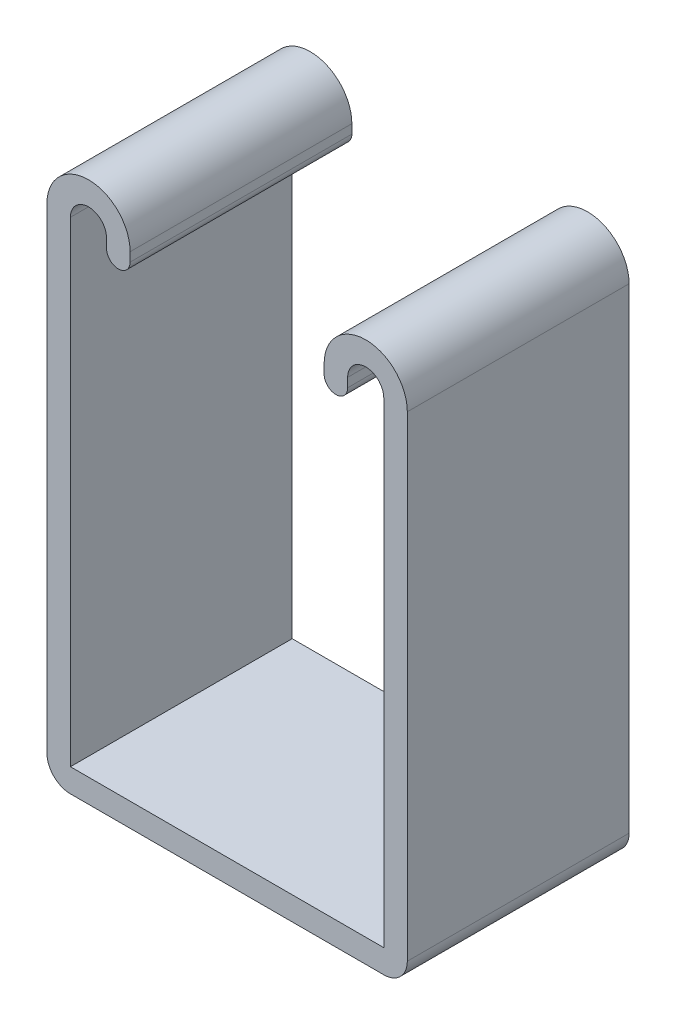
ISO-10303-21;
HEADER;
FILE_DESCRIPTION(('STEP AP214'),'2;1');
FILE_NAME('part.step','',(''),(''),'','','');
FILE_SCHEMA(('AUTOMOTIVE_DESIGN { 1 0 10303 214 1 1 1 1 }'));
ENDSEC;
DATA;
#1=APPLICATION_CONTEXT('core data for automotive mechanical design processes');
#2=APPLICATION_PROTOCOL_DEFINITION('international standard','automotive_design',2000,#1);
#3=PRODUCT_CONTEXT('',#1,'mechanical');
#4=PRODUCT('Part','Part','',(#3));
#5=PRODUCT_RELATED_PRODUCT_CATEGORY('part','',(#4));
#6=PRODUCT_DEFINITION_FORMATION('','',#4);
#7=PRODUCT_DEFINITION_CONTEXT('part definition',#1,'design');
#8=PRODUCT_DEFINITION('design','',#6,#7);
#9=PRODUCT_DEFINITION_SHAPE('','',#8);
#10=(LENGTH_UNIT() NAMED_UNIT(*) SI_UNIT(.MILLI.,.METRE.));
#11=(NAMED_UNIT(*) PLANE_ANGLE_UNIT() SI_UNIT($,.RADIAN.));
#12=(NAMED_UNIT(*) SI_UNIT($,.STERADIAN.) SOLID_ANGLE_UNIT());
#13=UNCERTAINTY_MEASURE_WITH_UNIT(LENGTH_MEASURE(1.E-05),#10,'distance_accuracy_value','');
#14=(GEOMETRIC_REPRESENTATION_CONTEXT(3) GLOBAL_UNCERTAINTY_ASSIGNED_CONTEXT((#13)) GLOBAL_UNIT_ASSIGNED_CONTEXT((#10,
#11,#12)) REPRESENTATION_CONTEXT('',''));
#15=CARTESIAN_POINT('',(0.,0.,0.));
#16=DIRECTION('',(0.,0.,1.));
#17=DIRECTION('',(1.,0.,0.));
#18=AXIS2_PLACEMENT_3D('',#15,#16,#17);
#19=CARTESIAN_POINT('',(-15.875,29.1719,12.7));
#20=DIRECTION('',(0.,0.,-1.));
#21=DIRECTION('',(-1.,0.,0.));
#22=AXIS2_PLACEMENT_3D('',#19,#20,#21);
#23=CYLINDRICAL_SURFACE('',#22,4.7625);
#24=CARTESIAN_POINT('',(-15.875,29.1719,-12.7));
#25=DIRECTION('',(0.,0.,1.));
#26=DIRECTION('',(-1.,0.,0.));
#27=AXIS2_PLACEMENT_3D('',#24,#25,#26);
#28=CIRCLE('',#27,4.7625);
#29=CARTESIAN_POINT('',(-11.1125,29.1719,-12.7));
#30=VERTEX_POINT('',#29);
#31=CARTESIAN_POINT('',(-20.6375,29.1719,-12.7));
#32=VERTEX_POINT('',#31);
#33=EDGE_CURVE('E188',#30,#32,#28,.T.);
#34=ORIENTED_EDGE('',*,*,#33,.T.);
#35=DIRECTION('',(0.,0.,-1.));
#36=VECTOR('',#35,1.);
#37=CARTESIAN_POINT('',(-20.6375,29.1719,12.7));
#38=LINE('',#37,#36);
#39=CARTESIAN_POINT('',(-20.6375,29.1719,12.7));
#40=VERTEX_POINT('',#39);
#41=EDGE_CURVE('E11',#40,#32,#38,.T.);
#42=ORIENTED_EDGE('',*,*,#41,.F.);
#43=CARTESIAN_POINT('',(-15.875,29.1719,12.7));
#44=DIRECTION('',(0.,0.,1.));
#45=DIRECTION('',(-1.,0.,0.));
#46=AXIS2_PLACEMENT_3D('',#43,#44,#45);
#47=CIRCLE('',#46,4.7625);
#48=CARTESIAN_POINT('',(-11.1125,29.1719,12.7));
#49=VERTEX_POINT('',#48);
#50=EDGE_CURVE('E222',#49,#40,#47,.T.);
#51=ORIENTED_EDGE('',*,*,#50,.F.);
#52=DIRECTION('',(0.,0.,-1.));
#53=VECTOR('',#52,1.);
#54=CARTESIAN_POINT('',(-11.1125,29.1719,12.7));
#55=LINE('',#54,#53);
#56=EDGE_CURVE('E184',#49,#30,#55,.T.);
#57=ORIENTED_EDGE('',*,*,#56,.T.);
#58=EDGE_LOOP('',(#34,#42,#51,#57));
#59=FACE_BOUND('',#58,.T.);
#60=ADVANCED_FACE('F32',(#59),#23,.T.);
#61=CARTESIAN_POINT('',(-20.6375,29.1719,12.7));
#62=DIRECTION('',(1.,0.,0.));
#63=DIRECTION('',(0.,1.,0.));
#64=AXIS2_PLACEMENT_3D('',#61,#62,#63);
#65=PLANE('',#64);
#66=DIRECTION('',(0.,-1.,0.));
#67=VECTOR('',#66,1.);
#68=CARTESIAN_POINT('',(-20.6375,29.1719,-12.7));
#69=LINE('',#68,#67);
#70=CARTESIAN_POINT('',(-20.6375,-25.3238,-12.7));
#71=VERTEX_POINT('',#70);
#72=EDGE_CURVE('E191',#32,#71,#69,.T.);
#73=ORIENTED_EDGE('',*,*,#72,.T.);
#74=DIRECTION('',(0.,0.,-1.));
#75=VECTOR('',#74,1.);
#76=CARTESIAN_POINT('',(-20.6375,-25.3238,12.7));
#77=LINE('',#76,#75);
#78=CARTESIAN_POINT('',(-20.6375,-25.3238,12.7));
#79=VERTEX_POINT('',#78);
#80=EDGE_CURVE('E40',#79,#71,#77,.T.);
#81=ORIENTED_EDGE('',*,*,#80,.F.);
#82=DIRECTION('',(0.,-1.,0.));
#83=VECTOR('',#82,1.);
#84=CARTESIAN_POINT('',(-20.6375,29.1719,12.7));
#85=LINE('',#84,#83);
#86=EDGE_CURVE('E121',#40,#79,#85,.T.);
#87=ORIENTED_EDGE('',*,*,#86,.F.);
#88=ORIENTED_EDGE('',*,*,#41,.T.);
#89=EDGE_LOOP('',(#73,#81,#87,#88));
#90=FACE_BOUND('',#89,.T.);
#91=ADVANCED_FACE('F330',(#90),#65,.F.);
#92=CARTESIAN_POINT('',(-17.9451,-25.3238,12.7));
#93=DIRECTION('',(0.,0.,-1.));
#94=DIRECTION('',(-1.,0.,0.));
#95=AXIS2_PLACEMENT_3D('',#92,#93,#94);
#96=CYLINDRICAL_SURFACE('',#95,2.6924);
#97=CARTESIAN_POINT('',(-17.9451,-25.3238,-12.7));
#98=DIRECTION('',(0.,0.,1.));
#99=DIRECTION('',(-1.,0.,0.));
#100=AXIS2_PLACEMENT_3D('',#97,#98,#99);
#101=CIRCLE('',#100,2.6924);
#102=CARTESIAN_POINT('',(-17.9451,-28.0162,-12.7));
#103=VERTEX_POINT('',#102);
#104=EDGE_CURVE('E193',#71,#103,#101,.T.);
#105=ORIENTED_EDGE('',*,*,#104,.T.);
#106=DIRECTION('',(0.,0.,-1.));
#107=VECTOR('',#106,1.);
#108=CARTESIAN_POINT('',(-17.9451,-28.0162,12.7));
#109=LINE('',#108,#107);
#110=CARTESIAN_POINT('',(-17.9451,-28.0162,12.7));
#111=VERTEX_POINT('',#110);
#112=EDGE_CURVE('E259',#111,#103,#109,.T.);
#113=ORIENTED_EDGE('',*,*,#112,.F.);
#114=CARTESIAN_POINT('',(-17.9451,-25.3238,12.7));
#115=DIRECTION('',(0.,0.,1.));
#116=DIRECTION('',(-1.,0.,0.));
#117=AXIS2_PLACEMENT_3D('',#114,#115,#116);
#118=CIRCLE('',#117,2.6924);
#119=EDGE_CURVE('E267',#79,#111,#118,.T.);
#120=ORIENTED_EDGE('',*,*,#119,.F.);
#121=ORIENTED_EDGE('',*,*,#80,.T.);
#122=EDGE_LOOP('',(#105,#113,#120,#121));
#123=FACE_BOUND('',#122,.T.);
#124=ADVANCED_FACE('F265',(#123),#96,.T.);
#125=CARTESIAN_POINT('',(-17.9451,-28.0162,12.7));
#126=DIRECTION('',(0.,1.,0.));
#127=DIRECTION('',(-1.,0.,0.));
#128=AXIS2_PLACEMENT_3D('',#125,#126,#127);
#129=PLANE('',#128);
#130=DIRECTION('',(1.,0.,0.));
#131=VECTOR('',#130,1.);
#132=CARTESIAN_POINT('',(-17.9451,-28.0162,-12.7));
#133=LINE('',#132,#131);
#134=CARTESIAN_POINT('',(17.9451,-28.0162,-12.7));
#135=VERTEX_POINT('',#134);
#136=EDGE_CURVE('E195',#103,#135,#133,.T.);
#137=ORIENTED_EDGE('',*,*,#136,.T.);
#138=DIRECTION('',(0.,0.,-1.));
#139=VECTOR('',#138,1.);
#140=CARTESIAN_POINT('',(17.9451,-28.0162,12.7));
#141=LINE('',#140,#139);
#142=CARTESIAN_POINT('',(17.9451,-28.0162,12.7));
#143=VERTEX_POINT('',#142);
#144=EDGE_CURVE('E256',#143,#135,#141,.T.);
#145=ORIENTED_EDGE('',*,*,#144,.F.);
#146=DIRECTION('',(1.,0.,0.));
#147=VECTOR('',#146,1.);
#148=CARTESIAN_POINT('',(-17.9451,-28.0162,12.7));
#149=LINE('',#148,#147);
#150=EDGE_CURVE('E285',#111,#143,#149,.T.);
#151=ORIENTED_EDGE('',*,*,#150,.F.);
#152=ORIENTED_EDGE('',*,*,#112,.T.);
#153=EDGE_LOOP('',(#137,#145,#151,#152));
#154=FACE_BOUND('',#153,.T.);
#155=ADVANCED_FACE('F276',(#154),#129,.F.);
#156=CARTESIAN_POINT('',(17.9451,-25.3238,12.7));
#157=DIRECTION('',(0.,0.,-1.));
#158=DIRECTION('',(-1.,0.,0.));
#159=AXIS2_PLACEMENT_3D('',#156,#157,#158);
#160=CYLINDRICAL_SURFACE('',#159,2.6924);
#161=CARTESIAN_POINT('',(17.9451,-25.3238,-12.7));
#162=DIRECTION('',(0.,0.,1.));
#163=DIRECTION('',(1.,0.,0.));
#164=AXIS2_PLACEMENT_3D('',#161,#162,#163);
#165=CIRCLE('',#164,2.6924);
#166=CARTESIAN_POINT('',(20.6375,-25.3238,-12.7));
#167=VERTEX_POINT('',#166);
#168=EDGE_CURVE('E197',#135,#167,#165,.T.);
#169=ORIENTED_EDGE('',*,*,#168,.T.);
#170=DIRECTION('',(0.,0.,-1.));
#171=VECTOR('',#170,1.);
#172=CARTESIAN_POINT('',(20.6375,-25.3238,12.7));
#173=LINE('',#172,#171);
#174=CARTESIAN_POINT('',(20.6375,-25.3238,12.7));
#175=VERTEX_POINT('',#174);
#176=EDGE_CURVE('E253',#175,#167,#173,.T.);
#177=ORIENTED_EDGE('',*,*,#176,.F.);
#178=CARTESIAN_POINT('',(17.9451,-25.3238,12.7));
#179=DIRECTION('',(0.,0.,1.));
#180=DIRECTION('',(1.,0.,0.));
#181=AXIS2_PLACEMENT_3D('',#178,#179,#180);
#182=CIRCLE('',#181,2.6924);
#183=EDGE_CURVE('E282',#143,#175,#182,.T.);
#184=ORIENTED_EDGE('',*,*,#183,.F.);
#185=ORIENTED_EDGE('',*,*,#144,.T.);
#186=EDGE_LOOP('',(#169,#177,#184,#185));
#187=FACE_BOUND('',#186,.T.);
#188=ADVANCED_FACE('F280',(#187),#160,.T.);
#189=CARTESIAN_POINT('',(20.6375,-25.3238,12.7));
#190=DIRECTION('',(-1.,0.,0.));
#191=DIRECTION('',(0.,-1.,0.));
#192=AXIS2_PLACEMENT_3D('',#189,#190,#191);
#193=PLANE('',#192);
#194=DIRECTION('',(0.,1.,0.));
#195=VECTOR('',#194,1.);
#196=CARTESIAN_POINT('',(20.6375,-25.3238,-12.7));
#197=LINE('',#196,#195);
#198=CARTESIAN_POINT('',(20.6375,29.1719,-12.7));
#199=VERTEX_POINT('',#198);
#200=EDGE_CURVE('E199',#167,#199,#197,.T.);
#201=ORIENTED_EDGE('',*,*,#200,.T.);
#202=DIRECTION('',(0.,0.,-1.));
#203=VECTOR('',#202,1.);
#204=CARTESIAN_POINT('',(20.6375,29.1719,12.7));
#205=LINE('',#204,#203);
#206=CARTESIAN_POINT('',(20.6375,29.1719,12.7));
#207=VERTEX_POINT('',#206);
#208=EDGE_CURVE('E250',#207,#199,#205,.T.);
#209=ORIENTED_EDGE('',*,*,#208,.F.);
#210=DIRECTION('',(0.,1.,0.));
#211=VECTOR('',#210,1.);
#212=CARTESIAN_POINT('',(20.6375,-25.3238,12.7));
#213=LINE('',#212,#211);
#214=EDGE_CURVE('E284',#175,#207,#213,.T.);
#215=ORIENTED_EDGE('',*,*,#214,.F.);
#216=ORIENTED_EDGE('',*,*,#176,.T.);
#217=EDGE_LOOP('',(#201,#209,#215,#216));
#218=FACE_BOUND('',#217,.T.);
#219=ADVANCED_FACE('F343',(#218),#193,.F.);
#220=CARTESIAN_POINT('',(15.875,29.1719,12.7));
#221=DIRECTION('',(0.,0.,-1.));
#222=DIRECTION('',(-1.,0.,0.));
#223=AXIS2_PLACEMENT_3D('',#220,#221,#222);
#224=CYLINDRICAL_SURFACE('',#223,4.7625);
#225=CARTESIAN_POINT('',(15.875,29.1719,-12.7));
#226=DIRECTION('',(0.,0.,1.));
#227=DIRECTION('',(1.,0.,0.));
#228=AXIS2_PLACEMENT_3D('',#225,#226,#227);
#229=CIRCLE('',#228,4.7625);
#230=CARTESIAN_POINT('',(11.1125,29.1719,-12.7));
#231=VERTEX_POINT('',#230);
#232=EDGE_CURVE('E201',#199,#231,#229,.T.);
#233=ORIENTED_EDGE('',*,*,#232,.T.);
#234=DIRECTION('',(0.,0.,-1.));
#235=VECTOR('',#234,1.);
#236=CARTESIAN_POINT('',(11.1125,29.1719,12.7));
#237=LINE('',#236,#235);
#238=CARTESIAN_POINT('',(11.1125,29.1719,12.7));
#239=VERTEX_POINT('',#238);
#240=EDGE_CURVE('E247',#239,#231,#237,.T.);
#241=ORIENTED_EDGE('',*,*,#240,.F.);
#242=CARTESIAN_POINT('',(15.875,29.1719,12.7));
#243=DIRECTION('',(0.,0.,1.));
#244=DIRECTION('',(1.,0.,0.));
#245=AXIS2_PLACEMENT_3D('',#242,#243,#244);
#246=CIRCLE('',#245,4.7625);
#247=EDGE_CURVE('E287',#207,#239,#246,.T.);
#248=ORIENTED_EDGE('',*,*,#247,.F.);
#249=ORIENTED_EDGE('',*,*,#208,.T.);
#250=EDGE_LOOP('',(#233,#241,#248,#249));
#251=FACE_BOUND('',#250,.T.);
#252=ADVANCED_FACE('F346',(#251),#224,.T.);
#253=CARTESIAN_POINT('',(11.1125,29.1719,12.7));
#254=DIRECTION('',(1.,0.,0.));
#255=DIRECTION('',(0.,1.,0.));
#256=AXIS2_PLACEMENT_3D('',#253,#254,#255);
#257=PLANE('',#256);
#258=DIRECTION('',(0.,-1.,0.));
#259=VECTOR('',#258,1.);
#260=CARTESIAN_POINT('',(11.1125,29.1719,-12.7));
#261=LINE('',#260,#259);
#262=CARTESIAN_POINT('',(11.1125,28.13685,-12.7));
#263=VERTEX_POINT('',#262);
#264=EDGE_CURVE('E203',#231,#263,#261,.T.);
#265=ORIENTED_EDGE('',*,*,#264,.T.);
#266=DIRECTION('',(0.,0.,-1.));
#267=VECTOR('',#266,1.);
#268=CARTESIAN_POINT('',(11.1125,28.13685,12.7));
#269=LINE('',#268,#267);
#270=CARTESIAN_POINT('',(11.1125,28.13685,12.7));
#271=VERTEX_POINT('',#270);
#272=EDGE_CURVE('E244',#271,#263,#269,.T.);
#273=ORIENTED_EDGE('',*,*,#272,.F.);
#274=DIRECTION('',(0.,-1.,0.));
#275=VECTOR('',#274,1.);
#276=CARTESIAN_POINT('',(11.1125,29.1719,12.7));
#277=LINE('',#276,#275);
#278=EDGE_CURVE('E293',#239,#271,#277,.T.);
#279=ORIENTED_EDGE('',*,*,#278,.F.);
#280=ORIENTED_EDGE('',*,*,#240,.T.);
#281=EDGE_LOOP('',(#265,#273,#279,#280));
#282=FACE_BOUND('',#281,.T.);
#283=ADVANCED_FACE('F350',(#282),#257,.F.);
#284=CARTESIAN_POINT('',(12.4587,28.13685,12.7));
#285=DIRECTION('',(0.,0.,-1.));
#286=DIRECTION('',(-1.,0.,0.));
#287=AXIS2_PLACEMENT_3D('',#284,#285,#286);
#288=CYLINDRICAL_SURFACE('',#287,1.3462);
#289=CARTESIAN_POINT('',(12.4587,28.13685,-12.7));
#290=DIRECTION('',(0.,0.,1.));
#291=DIRECTION('',(1.,0.,0.));
#292=AXIS2_PLACEMENT_3D('',#289,#290,#291);
#293=CIRCLE('',#292,1.3462);
#294=CARTESIAN_POINT('',(13.8049,28.13685,-12.7));
#295=VERTEX_POINT('',#294);
#296=EDGE_CURVE('E205',#263,#295,#293,.T.);
#297=ORIENTED_EDGE('',*,*,#296,.T.);
#298=DIRECTION('',(0.,0.,-1.));
#299=VECTOR('',#298,1.);
#300=CARTESIAN_POINT('',(13.8049,28.13685,12.7));
#301=LINE('',#300,#299);
#302=CARTESIAN_POINT('',(13.8049,28.13685,12.7));
#303=VERTEX_POINT('',#302);
#304=EDGE_CURVE('E241',#303,#295,#301,.T.);
#305=ORIENTED_EDGE('',*,*,#304,.F.);
#306=CARTESIAN_POINT('',(12.4587,28.13685,12.7));
#307=DIRECTION('',(0.,0.,1.));
#308=DIRECTION('',(1.,0.,0.));
#309=AXIS2_PLACEMENT_3D('',#306,#307,#308);
#310=CIRCLE('',#309,1.3462);
#311=EDGE_CURVE('E295',#271,#303,#310,.T.);
#312=ORIENTED_EDGE('',*,*,#311,.F.);
#313=ORIENTED_EDGE('',*,*,#272,.T.);
#314=EDGE_LOOP('',(#297,#305,#312,#313));
#315=FACE_BOUND('',#314,.T.);
#316=ADVANCED_FACE('F354',(#315),#288,.T.);
#317=CARTESIAN_POINT('',(13.8049,29.1719,12.7));
#318=DIRECTION('',(-1.,0.,0.));
#319=DIRECTION('',(0.,0.,1.));
#320=AXIS2_PLACEMENT_3D('',#317,#318,#319);
#321=PLANE('',#320);
#322=DIRECTION('',(0.,1.,0.));
#323=VECTOR('',#322,1.);
#324=CARTESIAN_POINT('',(13.8049,29.1719,-12.7));
#325=LINE('',#324,#323);
#326=CARTESIAN_POINT('',(13.8049,29.1719,-12.7));
#327=VERTEX_POINT('',#326);
#328=EDGE_CURVE('E207',#295,#327,#325,.T.);
#329=ORIENTED_EDGE('',*,*,#328,.T.);
#330=DIRECTION('',(0.,0.,-1.));
#331=VECTOR('',#330,1.);
#332=CARTESIAN_POINT('',(13.8049,29.1719,12.7));
#333=LINE('',#332,#331);
#334=CARTESIAN_POINT('',(13.8049,29.1719,12.7));
#335=VERTEX_POINT('',#334);
#336=EDGE_CURVE('E238',#335,#327,#333,.T.);
#337=ORIENTED_EDGE('',*,*,#336,.F.);
#338=DIRECTION('',(0.,1.,0.));
#339=VECTOR('',#338,1.);
#340=CARTESIAN_POINT('',(13.8049,29.1719,12.7));
#341=LINE('',#340,#339);
#342=EDGE_CURVE('E297',#303,#335,#341,.T.);
#343=ORIENTED_EDGE('',*,*,#342,.F.);
#344=ORIENTED_EDGE('',*,*,#304,.T.);
#345=EDGE_LOOP('',(#329,#337,#343,#344));
#346=FACE_BOUND('',#345,.T.);
#347=ADVANCED_FACE('F358',(#346),#321,.F.);
#348=CARTESIAN_POINT('',(15.875,29.1719,12.7));
#349=DIRECTION('',(0.,0.,-1.));
#350=DIRECTION('',(-1.,0.,0.));
#351=AXIS2_PLACEMENT_3D('',#348,#349,#350);
#352=CYLINDRICAL_SURFACE('',#351,2.0701);
#353=CARTESIAN_POINT('',(15.875,29.1719,-12.7));
#354=DIRECTION('',(0.,0.,-1.));
#355=DIRECTION('',(1.,0.,0.));
#356=AXIS2_PLACEMENT_3D('',#353,#354,#355);
#357=CIRCLE('',#356,2.0701);
#358=CARTESIAN_POINT('',(17.9451,29.1719,-12.7));
#359=VERTEX_POINT('',#358);
#360=EDGE_CURVE('E209',#327,#359,#357,.T.);
#361=ORIENTED_EDGE('',*,*,#360,.T.);
#362=DIRECTION('',(0.,0.,-1.));
#363=VECTOR('',#362,1.);
#364=CARTESIAN_POINT('',(17.9451,29.1719,12.7));
#365=LINE('',#364,#363);
#366=CARTESIAN_POINT('',(17.9451,29.1719,12.7));
#367=VERTEX_POINT('',#366);
#368=EDGE_CURVE('E235',#367,#359,#365,.T.);
#369=ORIENTED_EDGE('',*,*,#368,.F.);
#370=CARTESIAN_POINT('',(15.875,29.1719,12.7));
#371=DIRECTION('',(0.,0.,-1.));
#372=DIRECTION('',(1.,0.,0.));
#373=AXIS2_PLACEMENT_3D('',#370,#371,#372);
#374=CIRCLE('',#373,2.0701);
#375=EDGE_CURVE('E299',#335,#367,#374,.T.);
#376=ORIENTED_EDGE('',*,*,#375,.F.);
#377=ORIENTED_EDGE('',*,*,#336,.T.);
#378=EDGE_LOOP('',(#361,#369,#376,#377));
#379=FACE_BOUND('',#378,.T.);
#380=ADVANCED_FACE('F362',(#379),#352,.F.);
#381=CARTESIAN_POINT('',(17.9451,-25.3238,12.7));
#382=DIRECTION('',(1.,0.,0.));
#383=DIRECTION('',(0.,0.,-1.));
#384=AXIS2_PLACEMENT_3D('',#381,#382,#383);
#385=PLANE('',#384);
#386=DIRECTION('',(0.,-1.,0.));
#387=VECTOR('',#386,1.);
#388=CARTESIAN_POINT('',(17.9451,-25.3238,-12.7));
#389=LINE('',#388,#387);
#390=CARTESIAN_POINT('',(17.9451,-25.3238,-12.7));
#391=VERTEX_POINT('',#390);
#392=EDGE_CURVE('E211',#359,#391,#389,.T.);
#393=ORIENTED_EDGE('',*,*,#392,.T.);
#394=DIRECTION('',(0.,0.,-1.));
#395=VECTOR('',#394,1.);
#396=CARTESIAN_POINT('',(17.9451,-25.3238,12.7));
#397=LINE('',#396,#395);
#398=CARTESIAN_POINT('',(17.9451,-25.3238,12.7));
#399=VERTEX_POINT('',#398);
#400=EDGE_CURVE('E232',#399,#391,#397,.T.);
#401=ORIENTED_EDGE('',*,*,#400,.F.);
#402=DIRECTION('',(0.,-1.,0.));
#403=VECTOR('',#402,1.);
#404=CARTESIAN_POINT('',(17.9451,-25.3238,12.7));
#405=LINE('',#404,#403);
#406=EDGE_CURVE('E301',#367,#399,#405,.T.);
#407=ORIENTED_EDGE('',*,*,#406,.F.);
#408=ORIENTED_EDGE('',*,*,#368,.T.);
#409=EDGE_LOOP('',(#393,#401,#407,#408));
#410=FACE_BOUND('',#409,.T.);
#411=ADVANCED_FACE('F366',(#410),#385,.F.);
#412=CARTESIAN_POINT('',(-17.9451,-25.3238,12.7));
#413=DIRECTION('',(0.,-1.,0.));
#414=DIRECTION('',(0.,0.,-1.));
#415=AXIS2_PLACEMENT_3D('',#412,#413,#414);
#416=PLANE('',#415);
#417=DIRECTION('',(-1.,0.,0.));
#418=VECTOR('',#417,1.);
#419=CARTESIAN_POINT('',(-17.9451,-25.3238,-12.7));
#420=LINE('',#419,#418);
#421=CARTESIAN_POINT('',(-17.9451,-25.3238,-12.7));
#422=VERTEX_POINT('',#421);
#423=EDGE_CURVE('E213',#391,#422,#420,.T.);
#424=ORIENTED_EDGE('',*,*,#423,.T.);
#425=DIRECTION('',(0.,0.,-1.));
#426=VECTOR('',#425,1.);
#427=CARTESIAN_POINT('',(-17.9451,-25.3238,12.7));
#428=LINE('',#427,#426);
#429=CARTESIAN_POINT('',(-17.9451,-25.3238,12.7));
#430=VERTEX_POINT('',#429);
#431=EDGE_CURVE('E229',#430,#422,#428,.T.);
#432=ORIENTED_EDGE('',*,*,#431,.F.);
#433=DIRECTION('',(-1.,0.,0.));
#434=VECTOR('',#433,1.);
#435=CARTESIAN_POINT('',(-17.9451,-25.3238,12.7));
#436=LINE('',#435,#434);
#437=EDGE_CURVE('E303',#399,#430,#436,.T.);
#438=ORIENTED_EDGE('',*,*,#437,.F.);
#439=ORIENTED_EDGE('',*,*,#400,.T.);
#440=EDGE_LOOP('',(#424,#432,#438,#439));
#441=FACE_BOUND('',#440,.T.);
#442=ADVANCED_FACE('F370',(#441),#416,.F.);
#443=CARTESIAN_POINT('',(-17.9451,29.1719,12.7));
#444=DIRECTION('',(-1.,0.,0.));
#445=DIRECTION('',(0.,-1.,0.));
#446=AXIS2_PLACEMENT_3D('',#443,#444,#445);
#447=PLANE('',#446);
#448=DIRECTION('',(0.,1.,0.));
#449=VECTOR('',#448,1.);
#450=CARTESIAN_POINT('',(-17.9451,29.1719,-12.7));
#451=LINE('',#450,#449);
#452=CARTESIAN_POINT('',(-17.9451,29.1719,-12.7));
#453=VERTEX_POINT('',#452);
#454=EDGE_CURVE('E215',#422,#453,#451,.T.);
#455=ORIENTED_EDGE('',*,*,#454,.T.);
#456=DIRECTION('',(0.,0.,-1.));
#457=VECTOR('',#456,1.);
#458=CARTESIAN_POINT('',(-17.9451,29.1719,12.7));
#459=LINE('',#458,#457);
#460=CARTESIAN_POINT('',(-17.9451,29.1719,12.7));
#461=VERTEX_POINT('',#460);
#462=EDGE_CURVE('E226',#461,#453,#459,.T.);
#463=ORIENTED_EDGE('',*,*,#462,.F.);
#464=DIRECTION('',(0.,1.,0.));
#465=VECTOR('',#464,1.);
#466=CARTESIAN_POINT('',(-17.9451,29.1719,12.7));
#467=LINE('',#466,#465);
#468=EDGE_CURVE('E305',#430,#461,#467,.T.);
#469=ORIENTED_EDGE('',*,*,#468,.F.);
#470=ORIENTED_EDGE('',*,*,#431,.T.);
#471=EDGE_LOOP('',(#455,#463,#469,#470));
#472=FACE_BOUND('',#471,.T.);
#473=ADVANCED_FACE('F311',(#472),#447,.F.);
#474=CARTESIAN_POINT('',(-15.875,29.1719,12.7));
#475=DIRECTION('',(0.,0.,-1.));
#476=DIRECTION('',(-1.,0.,0.));
#477=AXIS2_PLACEMENT_3D('',#474,#475,#476);
#478=CYLINDRICAL_SURFACE('',#477,2.0701);
#479=CARTESIAN_POINT('',(-15.875,29.1719,-12.7));
#480=DIRECTION('',(0.,0.,-1.));
#481=DIRECTION('',(-1.,0.,0.));
#482=AXIS2_PLACEMENT_3D('',#479,#480,#481);
#483=CIRCLE('',#482,2.0701);
#484=CARTESIAN_POINT('',(-13.8049,29.1719,-12.7));
#485=VERTEX_POINT('',#484);
#486=EDGE_CURVE('E217',#453,#485,#483,.T.);
#487=ORIENTED_EDGE('',*,*,#486,.T.);
#488=DIRECTION('',(0.,0.,-1.));
#489=VECTOR('',#488,1.);
#490=CARTESIAN_POINT('',(-13.8049,29.1719,12.7));
#491=LINE('',#490,#489);
#492=CARTESIAN_POINT('',(-13.8049,29.1719,12.7));
#493=VERTEX_POINT('',#492);
#494=EDGE_CURVE('E179',#493,#485,#491,.T.);
#495=ORIENTED_EDGE('',*,*,#494,.F.);
#496=CARTESIAN_POINT('',(-15.875,29.1719,12.7));
#497=DIRECTION('',(0.,0.,-1.));
#498=DIRECTION('',(-1.,0.,0.));
#499=AXIS2_PLACEMENT_3D('',#496,#497,#498);
#500=CIRCLE('',#499,2.0701);
#501=EDGE_CURVE('E170',#461,#493,#500,.T.);
#502=ORIENTED_EDGE('',*,*,#501,.F.);
#503=ORIENTED_EDGE('',*,*,#462,.T.);
#504=EDGE_LOOP('',(#487,#495,#502,#503));
#505=FACE_BOUND('',#504,.T.);
#506=ADVANCED_FACE('F315',(#505),#478,.F.);
#507=CARTESIAN_POINT('',(-13.8049,29.1719,12.7));
#508=DIRECTION('',(1.,0.,0.));
#509=DIRECTION('',(0.,0.,-1.));
#510=AXIS2_PLACEMENT_3D('',#507,#508,#509);
#511=PLANE('',#510);
#512=DIRECTION('',(0.,-1.,0.));
#513=VECTOR('',#512,1.);
#514=CARTESIAN_POINT('',(-13.8049,29.1719,-12.7));
#515=LINE('',#514,#513);
#516=CARTESIAN_POINT('',(-13.8049,28.13685,-12.7));
#517=VERTEX_POINT('',#516);
#518=EDGE_CURVE('E178',#485,#517,#515,.T.);
#519=ORIENTED_EDGE('',*,*,#518,.T.);
#520=DIRECTION('',(0.,0.,-1.));
#521=VECTOR('',#520,1.);
#522=CARTESIAN_POINT('',(-13.8049,28.13685,12.7));
#523=LINE('',#522,#521);
#524=CARTESIAN_POINT('',(-13.8049,28.13685,12.7));
#525=VERTEX_POINT('',#524);
#526=EDGE_CURVE('E175',#525,#517,#523,.T.);
#527=ORIENTED_EDGE('',*,*,#526,.F.);
#528=DIRECTION('',(0.,-1.,0.));
#529=VECTOR('',#528,1.);
#530=CARTESIAN_POINT('',(-13.8049,29.1719,12.7));
#531=LINE('',#530,#529);
#532=EDGE_CURVE('E164',#493,#525,#531,.T.);
#533=ORIENTED_EDGE('',*,*,#532,.F.);
#534=ORIENTED_EDGE('',*,*,#494,.T.);
#535=EDGE_LOOP('',(#519,#527,#533,#534));
#536=FACE_BOUND('',#535,.T.);
#537=ADVANCED_FACE('F176',(#536),#511,.F.);
#538=CARTESIAN_POINT('',(-12.4587,28.13685,12.7));
#539=DIRECTION('',(0.,0.,-1.));
#540=DIRECTION('',(-1.,0.,0.));
#541=AXIS2_PLACEMENT_3D('',#538,#539,#540);
#542=CYLINDRICAL_SURFACE('',#541,1.3462);
#543=CARTESIAN_POINT('',(-12.4587,28.13685,-12.7));
#544=DIRECTION('',(0.,0.,1.));
#545=DIRECTION('',(-1.,0.,0.));
#546=AXIS2_PLACEMENT_3D('',#543,#544,#545);
#547=CIRCLE('',#546,1.3462);
#548=CARTESIAN_POINT('',(-11.1125,28.13685,-12.7));
#549=VERTEX_POINT('',#548);
#550=EDGE_CURVE('E107',#517,#549,#547,.T.);
#551=ORIENTED_EDGE('',*,*,#550,.T.);
#552=DIRECTION('',(0.,0.,-1.));
#553=VECTOR('',#552,1.);
#554=CARTESIAN_POINT('',(-11.1125,28.13685,12.7));
#555=LINE('',#554,#553);
#556=CARTESIAN_POINT('',(-11.1125,28.13685,12.7));
#557=VERTEX_POINT('',#556);
#558=EDGE_CURVE('E180',#557,#549,#555,.T.);
#559=ORIENTED_EDGE('',*,*,#558,.F.);
#560=CARTESIAN_POINT('',(-12.4587,28.13685,12.7));
#561=DIRECTION('',(0.,0.,1.));
#562=DIRECTION('',(-1.,0.,0.));
#563=AXIS2_PLACEMENT_3D('',#560,#561,#562);
#564=CIRCLE('',#563,1.3462);
#565=EDGE_CURVE('E168',#525,#557,#564,.T.);
#566=ORIENTED_EDGE('',*,*,#565,.F.);
#567=ORIENTED_EDGE('',*,*,#526,.T.);
#568=EDGE_LOOP('',(#551,#559,#566,#567));
#569=FACE_BOUND('',#568,.T.);
#570=ADVANCED_FACE('F182',(#569),#542,.T.);
#571=CARTESIAN_POINT('',(-11.1125,29.1719,12.7));
#572=DIRECTION('',(-1.,0.,0.));
#573=DIRECTION('',(0.,-1.,0.));
#574=AXIS2_PLACEMENT_3D('',#571,#572,#573);
#575=PLANE('',#574);
#576=DIRECTION('',(0.,1.,0.));
#577=VECTOR('',#576,1.);
#578=CARTESIAN_POINT('',(-11.1125,29.1719,-12.7));
#579=LINE('',#578,#577);
#580=EDGE_CURVE('E113',#549,#30,#579,.T.);
#581=ORIENTED_EDGE('',*,*,#580,.T.);
#582=ORIENTED_EDGE('',*,*,#56,.F.);
#583=DIRECTION('',(0.,1.,0.));
#584=VECTOR('',#583,1.);
#585=CARTESIAN_POINT('',(-11.1125,29.1719,12.7));
#586=LINE('',#585,#584);
#587=EDGE_CURVE('E48',#557,#49,#586,.T.);
#588=ORIENTED_EDGE('',*,*,#587,.F.);
#589=ORIENTED_EDGE('',*,*,#558,.T.);
#590=EDGE_LOOP('',(#581,#582,#588,#589));
#591=FACE_BOUND('',#590,.T.);
#592=ADVANCED_FACE('F319',(#591),#575,.F.);
#593=CARTESIAN_POINT('',(-15.875,29.1719,12.7));
#594=DIRECTION('',(0.,0.,-1.));
#595=DIRECTION('',(-1.,0.,0.));
#596=AXIS2_PLACEMENT_3D('',#593,#594,#595);
#597=PLANE('',#596);
#598=ORIENTED_EDGE('',*,*,#50,.T.);
#599=ORIENTED_EDGE('',*,*,#86,.T.);
#600=ORIENTED_EDGE('',*,*,#119,.T.);
#601=ORIENTED_EDGE('',*,*,#150,.T.);
#602=ORIENTED_EDGE('',*,*,#183,.T.);
#603=ORIENTED_EDGE('',*,*,#214,.T.);
#604=ORIENTED_EDGE('',*,*,#247,.T.);
#605=ORIENTED_EDGE('',*,*,#278,.T.);
#606=ORIENTED_EDGE('',*,*,#311,.T.);
#607=ORIENTED_EDGE('',*,*,#342,.T.);
#608=ORIENTED_EDGE('',*,*,#375,.T.);
#609=ORIENTED_EDGE('',*,*,#406,.T.);
#610=ORIENTED_EDGE('',*,*,#437,.T.);
#611=ORIENTED_EDGE('',*,*,#468,.T.);
#612=ORIENTED_EDGE('',*,*,#501,.T.);
#613=ORIENTED_EDGE('',*,*,#532,.T.);
#614=ORIENTED_EDGE('',*,*,#565,.T.);
#615=ORIENTED_EDGE('',*,*,#587,.T.);
#616=EDGE_LOOP('',(#598,#599,#600,#601,#602,#603,#604,#605,#606,#607,#608,#609,#610,#611,#612,
#613,#614,#615));
#617=FACE_BOUND('',#616,.T.);
#618=ADVANCED_FACE('F166',(#617),#597,.F.);
#619=CARTESIAN_POINT('',(-15.875,29.1719,-12.7));
#620=DIRECTION('',(0.,0.,-1.));
#621=DIRECTION('',(-1.,0.,0.));
#622=AXIS2_PLACEMENT_3D('',#619,#620,#621);
#623=PLANE('',#622);
#624=ORIENTED_EDGE('',*,*,#33,.F.);
#625=ORIENTED_EDGE('',*,*,#580,.F.);
#626=ORIENTED_EDGE('',*,*,#550,.F.);
#627=ORIENTED_EDGE('',*,*,#518,.F.);
#628=ORIENTED_EDGE('',*,*,#486,.F.);
#629=ORIENTED_EDGE('',*,*,#454,.F.);
#630=ORIENTED_EDGE('',*,*,#423,.F.);
#631=ORIENTED_EDGE('',*,*,#392,.F.);
#632=ORIENTED_EDGE('',*,*,#360,.F.);
#633=ORIENTED_EDGE('',*,*,#328,.F.);
#634=ORIENTED_EDGE('',*,*,#296,.F.);
#635=ORIENTED_EDGE('',*,*,#264,.F.);
#636=ORIENTED_EDGE('',*,*,#232,.F.);
#637=ORIENTED_EDGE('',*,*,#200,.F.);
#638=ORIENTED_EDGE('',*,*,#168,.F.);
#639=ORIENTED_EDGE('',*,*,#136,.F.);
#640=ORIENTED_EDGE('',*,*,#104,.F.);
#641=ORIENTED_EDGE('',*,*,#72,.F.);
#642=EDGE_LOOP('',(#624,#625,#626,#627,#628,#629,#630,#631,#632,#633,#634,#635,#636,#637,#638,
#639,#640,#641));
#643=FACE_BOUND('',#642,.T.);
#644=ADVANCED_FACE('F271',(#643),#623,.T.);
#645=CLOSED_SHELL('',(#60,#91,#124,#155,#188,#219,#252,#283,#316,#347,#380,#411,#442,#473,#506,
#537,#570,#592,#618,#644));
#646=MANIFOLD_SOLID_BREP('B2',#645);
#647=ADVANCED_BREP_SHAPE_REPRESENTATION('',(#18,#646),#14);
#648=SHAPE_DEFINITION_REPRESENTATION(#9,#647);
ENDSEC;
END-ISO-10303-21;
